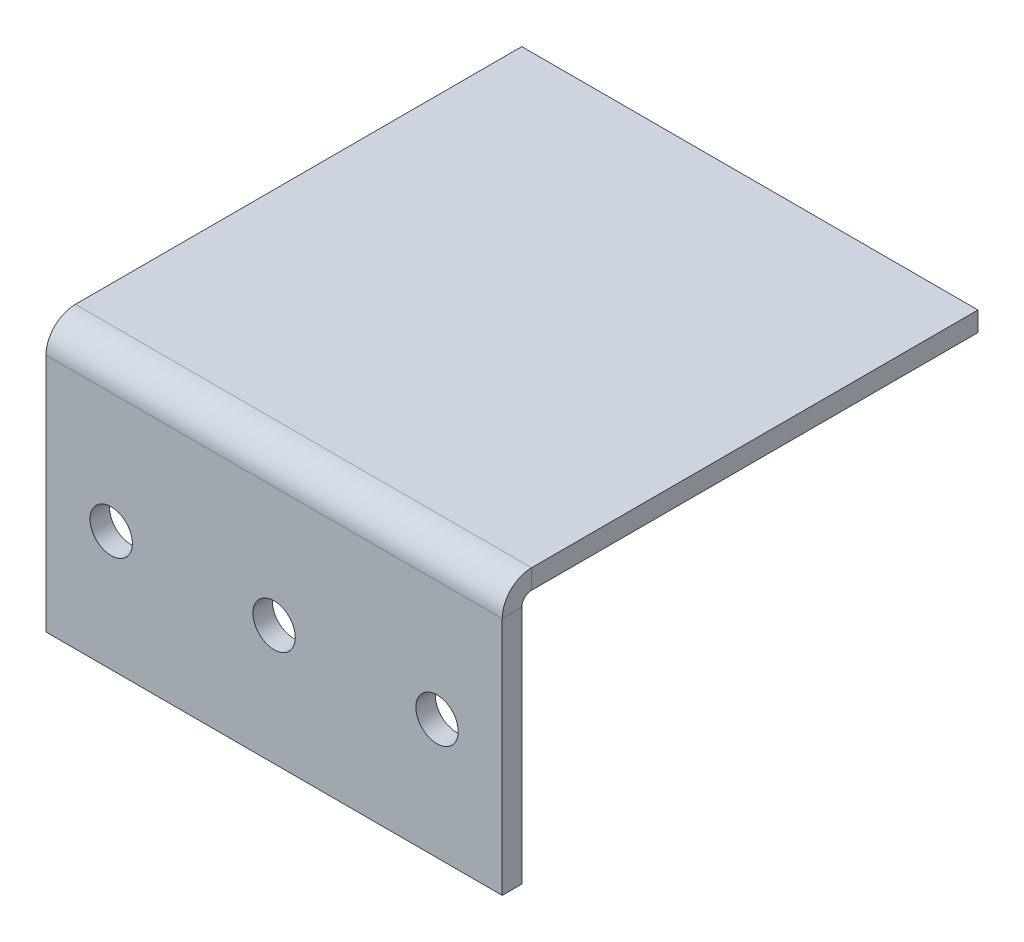
ISO-10303-21;
HEADER;
FILE_DESCRIPTION(('STEP AP214'),'2;1');
FILE_NAME('part.step','',(''),(''),'','','');
FILE_SCHEMA(('AUTOMOTIVE_DESIGN { 1 0 10303 214 1 1 1 1 }'));
ENDSEC;
DATA;
#1=APPLICATION_CONTEXT('core data for automotive mechanical design processes');
#2=APPLICATION_PROTOCOL_DEFINITION('international standard','automotive_design',2000,#1);
#3=PRODUCT_CONTEXT('',#1,'mechanical');
#4=PRODUCT('Part','Part','',(#3));
#5=PRODUCT_RELATED_PRODUCT_CATEGORY('part','',(#4));
#6=PRODUCT_DEFINITION_FORMATION('','',#4);
#7=PRODUCT_DEFINITION_CONTEXT('part definition',#1,'design');
#8=PRODUCT_DEFINITION('design','',#6,#7);
#9=PRODUCT_DEFINITION_SHAPE('','',#8);
#10=(LENGTH_UNIT() NAMED_UNIT(*) SI_UNIT(.MILLI.,.METRE.));
#11=(NAMED_UNIT(*) PLANE_ANGLE_UNIT() SI_UNIT($,.RADIAN.));
#12=(NAMED_UNIT(*) SI_UNIT($,.STERADIAN.) SOLID_ANGLE_UNIT());
#13=UNCERTAINTY_MEASURE_WITH_UNIT(LENGTH_MEASURE(1.E-05),#10,'distance_accuracy_value','');
#14=(GEOMETRIC_REPRESENTATION_CONTEXT(3) GLOBAL_UNCERTAINTY_ASSIGNED_CONTEXT((#13)) GLOBAL_UNIT_ASSIGNED_CONTEXT((#10,
#11,#12)) REPRESENTATION_CONTEXT('',''));
#15=CARTESIAN_POINT('',(0.,0.,0.));
#16=DIRECTION('',(0.,0.,1.));
#17=DIRECTION('',(1.,0.,0.));
#18=AXIS2_PLACEMENT_3D('',#15,#16,#17);
#19=CARTESIAN_POINT('',(35.,-38.2876110196153,2.99999999999988));
#20=DIRECTION('',(0.,0.,-1.));
#21=DIRECTION('',(0.,1.,0.));
#22=AXIS2_PLACEMENT_3D('',#19,#20,#21);
#23=PLANE('',#22);
#24=CARTESIAN_POINT('',(-25.,-19.8938055098077,3.00000000000001));
#25=DIRECTION('',(0.,0.,1.));
#26=DIRECTION('',(1.,0.,0.));
#27=AXIS2_PLACEMENT_3D('',#24,#25,#26);
#28=CIRCLE('',#27,3.25);
#29=CARTESIAN_POINT('',(-21.75,-19.8938055098077,3.00000000000001));
#30=VERTEX_POINT('',#29);
#31=EDGE_CURVE('E194',#30,#30,#28,.T.);
#32=ORIENTED_EDGE('',*,*,#31,.F.);
#33=EDGE_LOOP('',(#32));
#34=FACE_BOUND('',#33,.T.);
#35=CARTESIAN_POINT('',(0.,-19.8938055098077,3.00000000000001));
#36=DIRECTION('',(0.,0.,1.));
#37=DIRECTION('',(1.,0.,0.));
#38=AXIS2_PLACEMENT_3D('',#35,#36,#37);
#39=CIRCLE('',#38,3.25);
#40=CARTESIAN_POINT('',(3.25,-19.8938055098077,3.00000000000001));
#41=VERTEX_POINT('',#40);
#42=EDGE_CURVE('E221',#41,#41,#39,.T.);
#43=ORIENTED_EDGE('',*,*,#42,.F.);
#44=EDGE_LOOP('',(#43));
#45=FACE_BOUND('',#44,.T.);
#46=CARTESIAN_POINT('',(25.,-19.8938055098077,3.00000000000001));
#47=DIRECTION('',(0.,0.,1.));
#48=DIRECTION('',(1.,0.,0.));
#49=AXIS2_PLACEMENT_3D('',#46,#47,#48);
#50=CIRCLE('',#49,3.25);
#51=CARTESIAN_POINT('',(28.25,-19.8938055098077,3.00000000000001));
#52=VERTEX_POINT('',#51);
#53=EDGE_CURVE('E219',#52,#52,#50,.T.);
#54=ORIENTED_EDGE('',*,*,#53,.F.);
#55=EDGE_LOOP('',(#54));
#56=FACE_BOUND('',#55,.T.);
#57=DIRECTION('',(0.,1.,0.));
#58=VECTOR('',#57,1.);
#59=CARTESIAN_POINT('',(35.,-38.2876110196153,2.99999999999988));
#60=LINE('',#59,#58);
#61=CARTESIAN_POINT('',(35.,-1.50000000000002,3.00000000000001));
#62=VERTEX_POINT('',#61);
#63=CARTESIAN_POINT('',(35.,-38.2876110196153,2.99999999999988));
#64=VERTEX_POINT('',#63);
#65=EDGE_CURVE('E60',#62,#64,#60,.F.);
#66=ORIENTED_EDGE('',*,*,#65,.F.);
#67=DIRECTION('',(-1.,0.,0.));
#68=VECTOR('',#67,1.);
#69=CARTESIAN_POINT('',(35.,-1.50000000000002,3.00000000000001));
#70=LINE('',#69,#68);
#71=CARTESIAN_POINT('',(-35.,-1.50000000000002,3.00000000000001));
#72=VERTEX_POINT('',#71);
#73=EDGE_CURVE('E52',#62,#72,#70,.T.);
#74=ORIENTED_EDGE('',*,*,#73,.T.);
#75=DIRECTION('',(0.,1.,0.));
#76=VECTOR('',#75,1.);
#77=CARTESIAN_POINT('',(-35.,-38.2876110196153,2.99999999999988));
#78=LINE('',#77,#76);
#79=CARTESIAN_POINT('',(-35.,-38.2876110196153,2.99999999999988));
#80=VERTEX_POINT('',#79);
#81=EDGE_CURVE('E68',#72,#80,#78,.F.);
#82=ORIENTED_EDGE('',*,*,#81,.T.);
#83=DIRECTION('',(-1.,0.,0.));
#84=VECTOR('',#83,1.);
#85=CARTESIAN_POINT('',(35.,-38.2876110196153,2.99999999999988));
#86=LINE('',#85,#84);
#87=EDGE_CURVE('E136',#64,#80,#86,.T.);
#88=ORIENTED_EDGE('',*,*,#87,.F.);
#89=EDGE_LOOP('',(#66,#74,#82,#88));
#90=FACE_BOUND('',#89,.T.);
#91=ADVANCED_FACE('F43',(#34,#45,#56,#90),#23,.F.);
#92=CARTESIAN_POINT('',(-35.,1.7123889803847,0.));
#93=DIRECTION('',(1.,0.,0.));
#94=DIRECTION('',(0.,1.,0.));
#95=AXIS2_PLACEMENT_3D('',#92,#93,#94);
#96=PLANE('',#95);
#97=ORIENTED_EDGE('',*,*,#81,.F.);
#98=DIRECTION('',(0.,0.,-1.));
#99=VECTOR('',#98,1.);
#100=CARTESIAN_POINT('',(-35.,-1.5,0.));
#101=LINE('',#100,#99);
#102=CARTESIAN_POINT('',(-35.,-1.50000000000001,0.));
#103=VERTEX_POINT('',#102);
#104=EDGE_CURVE('E108',#72,#103,#101,.T.);
#105=ORIENTED_EDGE('',*,*,#104,.T.);
#106=DIRECTION('',(0.,-1.,0.));
#107=VECTOR('',#106,1.);
#108=CARTESIAN_POINT('',(-35.,-38.2876110196153,-1.21070682602705E-13));
#109=LINE('',#108,#107);
#110=CARTESIAN_POINT('',(-35.,-38.2876110196153,-1.21070682602705E-13));
#111=VERTEX_POINT('',#110);
#112=EDGE_CURVE('E111',#103,#111,#109,.T.);
#113=ORIENTED_EDGE('',*,*,#112,.T.);
#114=DIRECTION('',(0.,0.,1.));
#115=VECTOR('',#114,1.);
#116=CARTESIAN_POINT('',(-35.,-38.2876110196153,-1.21070682602705E-13));
#117=LINE('',#116,#115);
#118=EDGE_CURVE('E126',#111,#80,#117,.T.);
#119=ORIENTED_EDGE('',*,*,#118,.T.);
#120=EDGE_LOOP('',(#97,#105,#113,#119));
#121=FACE_BOUND('',#120,.T.);
#122=ADVANCED_FACE('F110',(#121),#96,.F.);
#123=CARTESIAN_POINT('',(35.,-38.2876110196153,-1.21070682602705E-13));
#124=DIRECTION('',(0.,-1.,0.));
#125=DIRECTION('',(1.,0.,0.));
#126=AXIS2_PLACEMENT_3D('',#123,#124,#125);
#127=PLANE('',#126);
#128=ORIENTED_EDGE('',*,*,#118,.F.);
#129=DIRECTION('',(-1.,0.,0.));
#130=VECTOR('',#129,1.);
#131=CARTESIAN_POINT('',(35.,-38.2876110196153,-1.21070682602705E-13));
#132=LINE('',#131,#130);
#133=CARTESIAN_POINT('',(35.,-38.2876110196153,-1.21070682602705E-13));
#134=VERTEX_POINT('',#133);
#135=EDGE_CURVE('E124',#134,#111,#132,.T.);
#136=ORIENTED_EDGE('',*,*,#135,.F.);
#137=DIRECTION('',(0.,0.,1.));
#138=VECTOR('',#137,1.);
#139=CARTESIAN_POINT('',(35.,-38.2876110196153,-1.21070682602705E-13));
#140=LINE('',#139,#138);
#141=EDGE_CURVE('E179',#134,#64,#140,.T.);
#142=ORIENTED_EDGE('',*,*,#141,.T.);
#143=ORIENTED_EDGE('',*,*,#87,.T.);
#144=EDGE_LOOP('',(#128,#136,#142,#143));
#145=FACE_BOUND('',#144,.T.);
#146=ADVANCED_FACE('F206',(#145),#127,.T.);
#147=CARTESIAN_POINT('',(35.,-38.2876110196153,-1.21070682602705E-13));
#148=DIRECTION('',(0.,0.,-1.));
#149=DIRECTION('',(0.,1.,0.));
#150=AXIS2_PLACEMENT_3D('',#147,#148,#149);
#151=PLANE('',#150);
#152=CARTESIAN_POINT('',(-25.,-19.8938055098077,0.));
#153=DIRECTION('',(0.,0.,-1.));
#154=DIRECTION('',(0.,1.,0.));
#155=AXIS2_PLACEMENT_3D('',#152,#153,#154);
#156=CIRCLE('',#155,3.25);
#157=CARTESIAN_POINT('',(-25.,-16.6438055098077,0.));
#158=VERTEX_POINT('',#157);
#159=EDGE_CURVE('E47',#158,#158,#156,.T.);
#160=ORIENTED_EDGE('',*,*,#159,.F.);
#161=EDGE_LOOP('',(#160));
#162=FACE_BOUND('',#161,.T.);
#163=CARTESIAN_POINT('',(0.,-19.8938055098077,0.));
#164=DIRECTION('',(0.,0.,-1.));
#165=DIRECTION('',(0.,1.,0.));
#166=AXIS2_PLACEMENT_3D('',#163,#164,#165);
#167=CIRCLE('',#166,3.25);
#168=CARTESIAN_POINT('',(0.,-16.6438055098077,0.));
#169=VERTEX_POINT('',#168);
#170=EDGE_CURVE('E193',#169,#169,#167,.T.);
#171=ORIENTED_EDGE('',*,*,#170,.F.);
#172=EDGE_LOOP('',(#171));
#173=FACE_BOUND('',#172,.T.);
#174=CARTESIAN_POINT('',(25.,-19.8938055098077,0.));
#175=DIRECTION('',(0.,0.,-1.));
#176=DIRECTION('',(0.,1.,0.));
#177=AXIS2_PLACEMENT_3D('',#174,#175,#176);
#178=CIRCLE('',#177,3.25);
#179=CARTESIAN_POINT('',(25.,-16.6438055098077,0.));
#180=VERTEX_POINT('',#179);
#181=EDGE_CURVE('E191',#180,#180,#178,.T.);
#182=ORIENTED_EDGE('',*,*,#181,.F.);
#183=EDGE_LOOP('',(#182));
#184=FACE_BOUND('',#183,.T.);
#185=DIRECTION('',(-1.,0.,0.));
#186=VECTOR('',#185,1.);
#187=CARTESIAN_POINT('',(35.,-1.50000000000001,0.));
#188=LINE('',#187,#186);
#189=CARTESIAN_POINT('',(35.,-1.50000000000001,0.));
#190=VERTEX_POINT('',#189);
#191=EDGE_CURVE('E117',#190,#103,#188,.T.);
#192=ORIENTED_EDGE('',*,*,#191,.F.);
#193=DIRECTION('',(0.,-1.,0.));
#194=VECTOR('',#193,1.);
#195=CARTESIAN_POINT('',(35.,-38.2876110196153,-1.21070682602705E-13));
#196=LINE('',#195,#194);
#197=EDGE_CURVE('E182',#190,#134,#196,.T.);
#198=ORIENTED_EDGE('',*,*,#197,.T.);
#199=ORIENTED_EDGE('',*,*,#135,.T.);
#200=ORIENTED_EDGE('',*,*,#112,.F.);
#201=EDGE_LOOP('',(#192,#198,#199,#200));
#202=FACE_BOUND('',#201,.T.);
#203=ADVANCED_FACE('F121',(#162,#173,#184,#202),#151,.T.);
#204=CARTESIAN_POINT('',(35.,1.7123889803847,0.));
#205=DIRECTION('',(1.,0.,0.));
#206=DIRECTION('',(0.,1.,0.));
#207=AXIS2_PLACEMENT_3D('',#204,#205,#206);
#208=PLANE('',#207);
#209=DIRECTION('',(0.,0.,-1.));
#210=VECTOR('',#209,1.);
#211=CARTESIAN_POINT('',(35.,-1.5,0.));
#212=LINE('',#211,#210);
#213=EDGE_CURVE('E12',#62,#190,#212,.T.);
#214=ORIENTED_EDGE('',*,*,#213,.F.);
#215=ORIENTED_EDGE('',*,*,#65,.T.);
#216=ORIENTED_EDGE('',*,*,#141,.F.);
#217=ORIENTED_EDGE('',*,*,#197,.F.);
#218=EDGE_LOOP('',(#214,#215,#216,#217));
#219=FACE_BOUND('',#218,.T.);
#220=ADVANCED_FACE('F45',(#219),#208,.T.);
#221=CARTESIAN_POINT('',(35.,3.,-70.));
#222=DIRECTION('',(0.,0.,-1.));
#223=DIRECTION('',(-1.,0.,0.));
#224=AXIS2_PLACEMENT_3D('',#221,#222,#223);
#225=PLANE('',#224);
#226=DIRECTION('',(0.,-1.,0.));
#227=VECTOR('',#226,1.);
#228=CARTESIAN_POINT('',(-35.,3.,-70.));
#229=LINE('',#228,#227);
#230=CARTESIAN_POINT('',(-35.,3.,-70.));
#231=VERTEX_POINT('',#230);
#232=CARTESIAN_POINT('',(-35.,0.,-70.));
#233=VERTEX_POINT('',#232);
#234=EDGE_CURVE('E165',#231,#233,#229,.T.);
#235=ORIENTED_EDGE('',*,*,#234,.F.);
#236=DIRECTION('',(-1.,0.,0.));
#237=VECTOR('',#236,1.);
#238=CARTESIAN_POINT('',(35.,3.,-70.));
#239=LINE('',#238,#237);
#240=CARTESIAN_POINT('',(35.,3.,-70.));
#241=VERTEX_POINT('',#240);
#242=EDGE_CURVE('E161',#241,#231,#239,.T.);
#243=ORIENTED_EDGE('',*,*,#242,.F.);
#244=DIRECTION('',(0.,-1.,0.));
#245=VECTOR('',#244,1.);
#246=CARTESIAN_POINT('',(35.,3.,-70.));
#247=LINE('',#246,#245);
#248=CARTESIAN_POINT('',(35.,0.,-70.));
#249=VERTEX_POINT('',#248);
#250=EDGE_CURVE('E175',#241,#249,#247,.T.);
#251=ORIENTED_EDGE('',*,*,#250,.T.);
#252=DIRECTION('',(-1.,0.,0.));
#253=VECTOR('',#252,1.);
#254=CARTESIAN_POINT('',(35.,0.,-70.));
#255=LINE('',#254,#253);
#256=EDGE_CURVE('E173',#249,#233,#255,.T.);
#257=ORIENTED_EDGE('',*,*,#256,.T.);
#258=EDGE_LOOP('',(#235,#243,#251,#257));
#259=FACE_BOUND('',#258,.T.);
#260=ADVANCED_FACE('F251',(#259),#225,.T.);
#261=CARTESIAN_POINT('',(35.,0.,40.));
#262=DIRECTION('',(0.,-1.,0.));
#263=DIRECTION('',(0.,0.,-1.));
#264=AXIS2_PLACEMENT_3D('',#261,#262,#263);
#265=PLANE('',#264);
#266=DIRECTION('',(0.,0.,1.));
#267=VECTOR('',#266,1.);
#268=CARTESIAN_POINT('',(35.,0.,40.));
#269=LINE('',#268,#267);
#270=CARTESIAN_POINT('',(35.,0.,-1.49999999999999));
#271=VERTEX_POINT('',#270);
#272=EDGE_CURVE('E171',#249,#271,#269,.T.);
#273=ORIENTED_EDGE('',*,*,#272,.T.);
#274=DIRECTION('',(-1.,0.,0.));
#275=VECTOR('',#274,1.);
#276=CARTESIAN_POINT('',(35.,0.,-1.49999999999999));
#277=LINE('',#276,#275);
#278=CARTESIAN_POINT('',(-35.,0.,-1.49999999999999));
#279=VERTEX_POINT('',#278);
#280=EDGE_CURVE('E168',#271,#279,#277,.T.);
#281=ORIENTED_EDGE('',*,*,#280,.T.);
#282=DIRECTION('',(0.,0.,1.));
#283=VECTOR('',#282,1.);
#284=CARTESIAN_POINT('',(-35.,0.,40.));
#285=LINE('',#284,#283);
#286=EDGE_CURVE('E163',#233,#279,#285,.T.);
#287=ORIENTED_EDGE('',*,*,#286,.F.);
#288=ORIENTED_EDGE('',*,*,#256,.F.);
#289=EDGE_LOOP('',(#273,#281,#287,#288));
#290=FACE_BOUND('',#289,.T.);
#291=ADVANCED_FACE('F254',(#290),#265,.T.);
#292=CARTESIAN_POINT('',(-35.,0.,0.));
#293=DIRECTION('',(1.,0.,0.));
#294=DIRECTION('',(0.,0.,-1.));
#295=AXIS2_PLACEMENT_3D('',#292,#293,#294);
#296=PLANE('',#295);
#297=DIRECTION('',(0.,-1.,0.));
#298=VECTOR('',#297,1.);
#299=CARTESIAN_POINT('',(-35.,0.,-1.49999999999999));
#300=LINE('',#299,#298);
#301=CARTESIAN_POINT('',(-35.,3.,-1.49999999999999));
#302=VERTEX_POINT('',#301);
#303=EDGE_CURVE('E141',#302,#279,#300,.T.);
#304=ORIENTED_EDGE('',*,*,#303,.F.);
#305=DIRECTION('',(0.,0.,-1.));
#306=VECTOR('',#305,1.);
#307=CARTESIAN_POINT('',(-35.,3.,40.));
#308=LINE('',#307,#306);
#309=EDGE_CURVE('E159',#231,#302,#308,.F.);
#310=ORIENTED_EDGE('',*,*,#309,.F.);
#311=ORIENTED_EDGE('',*,*,#234,.T.);
#312=ORIENTED_EDGE('',*,*,#286,.T.);
#313=EDGE_LOOP('',(#304,#310,#311,#312));
#314=FACE_BOUND('',#313,.T.);
#315=ADVANCED_FACE('F258',(#314),#296,.F.);
#316=CARTESIAN_POINT('',(35.,3.,40.));
#317=DIRECTION('',(0.,-1.,0.));
#318=DIRECTION('',(0.,0.,-1.));
#319=AXIS2_PLACEMENT_3D('',#316,#317,#318);
#320=PLANE('',#319);
#321=DIRECTION('',(-1.,0.,0.));
#322=VECTOR('',#321,1.);
#323=CARTESIAN_POINT('',(35.,3.,-1.49999999999999));
#324=LINE('',#323,#322);
#325=CARTESIAN_POINT('',(35.,3.,-1.49999999999999));
#326=VERTEX_POINT('',#325);
#327=EDGE_CURVE('E142',#326,#302,#324,.T.);
#328=ORIENTED_EDGE('',*,*,#327,.F.);
#329=DIRECTION('',(0.,0.,-1.));
#330=VECTOR('',#329,1.);
#331=CARTESIAN_POINT('',(35.,3.,40.));
#332=LINE('',#331,#330);
#333=EDGE_CURVE('E157',#241,#326,#332,.F.);
#334=ORIENTED_EDGE('',*,*,#333,.F.);
#335=ORIENTED_EDGE('',*,*,#242,.T.);
#336=ORIENTED_EDGE('',*,*,#309,.T.);
#337=EDGE_LOOP('',(#328,#334,#335,#336));
#338=FACE_BOUND('',#337,.T.);
#339=ADVANCED_FACE('F262',(#338),#320,.F.);
#340=CARTESIAN_POINT('',(35.,0.,0.));
#341=DIRECTION('',(1.,0.,0.));
#342=DIRECTION('',(0.,0.,-1.));
#343=AXIS2_PLACEMENT_3D('',#340,#341,#342);
#344=PLANE('',#343);
#345=ORIENTED_EDGE('',*,*,#333,.T.);
#346=DIRECTION('',(0.,-1.,0.));
#347=VECTOR('',#346,1.);
#348=CARTESIAN_POINT('',(35.,0.,-1.49999999999999));
#349=LINE('',#348,#347);
#350=EDGE_CURVE('E154',#326,#271,#349,.T.);
#351=ORIENTED_EDGE('',*,*,#350,.T.);
#352=ORIENTED_EDGE('',*,*,#272,.F.);
#353=ORIENTED_EDGE('',*,*,#250,.F.);
#354=EDGE_LOOP('',(#345,#351,#352,#353));
#355=FACE_BOUND('',#354,.T.);
#356=ADVANCED_FACE('F249',(#355),#344,.T.);
#357=CARTESIAN_POINT('',(35.,-1.5,-1.49999999999999));
#358=DIRECTION('',(-1.,0.,0.));
#359=DIRECTION('',(0.,0.,1.));
#360=AXIS2_PLACEMENT_3D('',#357,#358,#359);
#361=PLANE('',#360);
#362=ORIENTED_EDGE('',*,*,#350,.F.);
#363=CARTESIAN_POINT('',(35.,-1.5,-1.49999999999999));
#364=DIRECTION('',(-1.,0.,0.));
#365=DIRECTION('',(0.,0.,1.));
#366=AXIS2_PLACEMENT_3D('',#363,#364,#365);
#367=CIRCLE('',#366,4.5);
#368=EDGE_CURVE('E151',#326,#62,#367,.F.);
#369=ORIENTED_EDGE('',*,*,#368,.T.);
#370=ORIENTED_EDGE('',*,*,#213,.T.);
#371=CARTESIAN_POINT('',(35.,-1.5,-1.49999999999999));
#372=DIRECTION('',(1.,0.,0.));
#373=DIRECTION('',(0.,0.,-1.));
#374=AXIS2_PLACEMENT_3D('',#371,#372,#373);
#375=CIRCLE('',#374,1.5);
#376=EDGE_CURVE('E135',#271,#190,#375,.T.);
#377=ORIENTED_EDGE('',*,*,#376,.F.);
#378=EDGE_LOOP('',(#362,#369,#370,#377));
#379=FACE_BOUND('',#378,.T.);
#380=ADVANCED_FACE('F246',(#379),#361,.F.);
#381=CARTESIAN_POINT('',(-35.,-1.5,-1.49999999999999));
#382=DIRECTION('',(1.,0.,0.));
#383=DIRECTION('',(0.,0.,-1.));
#384=AXIS2_PLACEMENT_3D('',#381,#382,#383);
#385=PLANE('',#384);
#386=ORIENTED_EDGE('',*,*,#104,.F.);
#387=CARTESIAN_POINT('',(-35.,-1.5,-1.49999999999999));
#388=DIRECTION('',(-1.,0.,0.));
#389=DIRECTION('',(0.,0.,1.));
#390=AXIS2_PLACEMENT_3D('',#387,#388,#389);
#391=CIRCLE('',#390,4.5);
#392=EDGE_CURVE('E146',#72,#302,#391,.T.);
#393=ORIENTED_EDGE('',*,*,#392,.T.);
#394=ORIENTED_EDGE('',*,*,#303,.T.);
#395=CARTESIAN_POINT('',(-35.,-1.5,-1.49999999999999));
#396=DIRECTION('',(-1.,0.,0.));
#397=DIRECTION('',(0.,0.,-1.));
#398=AXIS2_PLACEMENT_3D('',#395,#396,#397);
#399=CIRCLE('',#398,1.5);
#400=EDGE_CURVE('E133',#103,#279,#399,.T.);
#401=ORIENTED_EDGE('',*,*,#400,.F.);
#402=EDGE_LOOP('',(#386,#393,#394,#401));
#403=FACE_BOUND('',#402,.T.);
#404=ADVANCED_FACE('F139',(#403),#385,.F.);
#405=CARTESIAN_POINT('',(70.2225505795856,-1.5,-1.49999999999999));
#406=DIRECTION('',(-1.,0.,0.));
#407=DIRECTION('',(0.,0.,1.));
#408=AXIS2_PLACEMENT_3D('',#405,#406,#407);
#409=CYLINDRICAL_SURFACE('',#408,1.5);
#410=ORIENTED_EDGE('',*,*,#400,.T.);
#411=ORIENTED_EDGE('',*,*,#280,.F.);
#412=ORIENTED_EDGE('',*,*,#376,.T.);
#413=ORIENTED_EDGE('',*,*,#191,.T.);
#414=EDGE_LOOP('',(#410,#411,#412,#413));
#415=FACE_BOUND('',#414,.T.);
#416=ADVANCED_FACE('F131',(#415),#409,.F.);
#417=CARTESIAN_POINT('',(70.2225505795856,-1.5,-1.49999999999999));
#418=DIRECTION('',(-1.,0.,0.));
#419=DIRECTION('',(0.,0.,1.));
#420=AXIS2_PLACEMENT_3D('',#417,#418,#419);
#421=CYLINDRICAL_SURFACE('',#420,4.5);
#422=ORIENTED_EDGE('',*,*,#392,.F.);
#423=ORIENTED_EDGE('',*,*,#73,.F.);
#424=ORIENTED_EDGE('',*,*,#368,.F.);
#425=ORIENTED_EDGE('',*,*,#327,.T.);
#426=EDGE_LOOP('',(#422,#423,#424,#425));
#427=FACE_BOUND('',#426,.T.);
#428=ADVANCED_FACE('F215',(#427),#421,.T.);
#429=CARTESIAN_POINT('',(25.,-19.8938055098077,-70.));
#430=DIRECTION('',(0.,0.,1.));
#431=DIRECTION('',(1.,0.,0.));
#432=AXIS2_PLACEMENT_3D('',#429,#430,#431);
#433=CYLINDRICAL_SURFACE('',#432,3.25);
#434=ORIENTED_EDGE('',*,*,#181,.T.);
#435=EDGE_LOOP('',(#434));
#436=FACE_BOUND('',#435,.T.);
#437=ORIENTED_EDGE('',*,*,#53,.T.);
#438=EDGE_LOOP('',(#437));
#439=FACE_BOUND('',#438,.T.);
#440=ADVANCED_FACE('F211',(#436,#439),#433,.F.);
#441=CARTESIAN_POINT('',(0.,-19.8938055098077,-70.));
#442=DIRECTION('',(0.,0.,1.));
#443=DIRECTION('',(1.,0.,0.));
#444=AXIS2_PLACEMENT_3D('',#441,#442,#443);
#445=CYLINDRICAL_SURFACE('',#444,3.25);
#446=ORIENTED_EDGE('',*,*,#170,.T.);
#447=EDGE_LOOP('',(#446));
#448=FACE_BOUND('',#447,.T.);
#449=ORIENTED_EDGE('',*,*,#42,.T.);
#450=EDGE_LOOP('',(#449));
#451=FACE_BOUND('',#450,.T.);
#452=ADVANCED_FACE('F214',(#448,#451),#445,.F.);
#453=CARTESIAN_POINT('',(-25.,-19.8938055098077,-70.));
#454=DIRECTION('',(0.,0.,1.));
#455=DIRECTION('',(1.,0.,0.));
#456=AXIS2_PLACEMENT_3D('',#453,#454,#455);
#457=CYLINDRICAL_SURFACE('',#456,3.25);
#458=ORIENTED_EDGE('',*,*,#159,.T.);
#459=EDGE_LOOP('',(#458));
#460=FACE_BOUND('',#459,.T.);
#461=ORIENTED_EDGE('',*,*,#31,.T.);
#462=EDGE_LOOP('',(#461));
#463=FACE_BOUND('',#462,.T.);
#464=ADVANCED_FACE('F201',(#460,#463),#457,.F.);
#465=CLOSED_SHELL('',(#91,#122,#146,#203,#220,#260,#291,#315,#339,#356,#380,#404,#416,#428,#440,
#452,#464));
#466=MANIFOLD_SOLID_BREP('B2',#465);
#467=ADVANCED_BREP_SHAPE_REPRESENTATION('',(#18,#466),#14);
#468=SHAPE_DEFINITION_REPRESENTATION(#9,#467);
ENDSEC;
END-ISO-10303-21;
